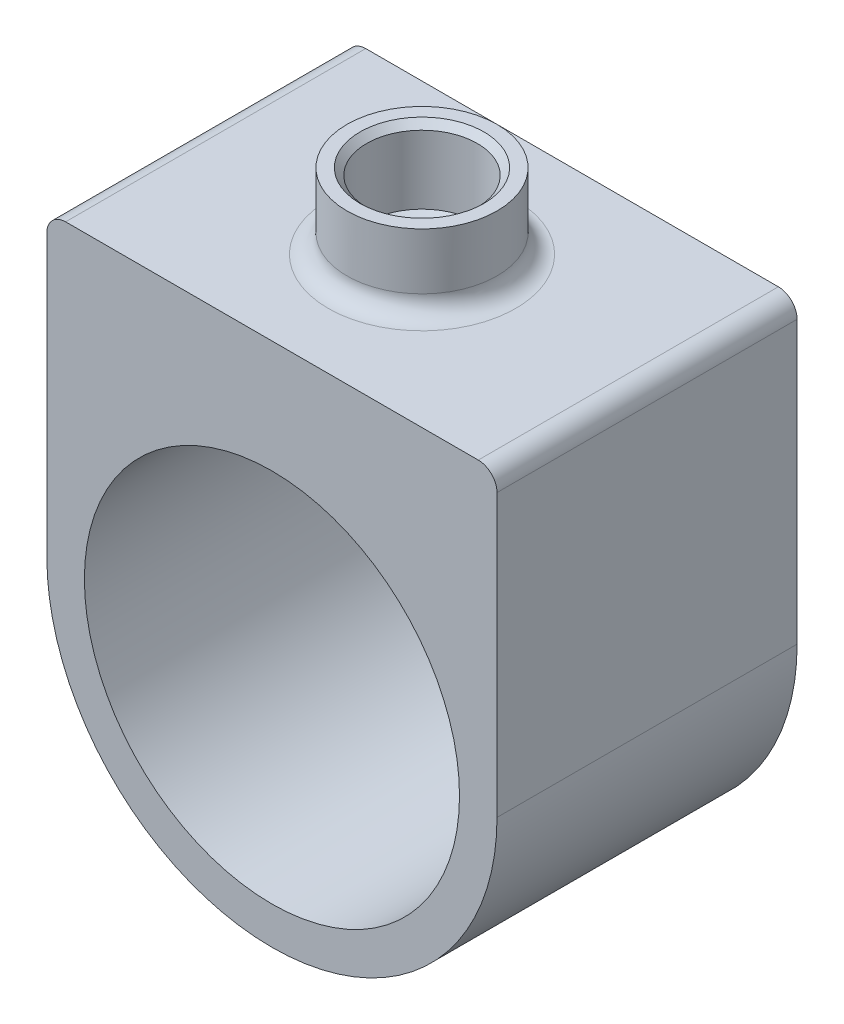
ISO-10303-21;
HEADER;
FILE_DESCRIPTION(('STEP AP214'),'2;1');
FILE_NAME('part.step','',(''),(''),'','','');
FILE_SCHEMA(('AUTOMOTIVE_DESIGN { 1 0 10303 214 1 1 1 1 }'));
ENDSEC;
DATA;
#1=APPLICATION_CONTEXT('core data for automotive mechanical design processes');
#2=APPLICATION_PROTOCOL_DEFINITION('international standard','automotive_design',2000,#1);
#3=PRODUCT_CONTEXT('',#1,'mechanical');
#4=PRODUCT('Part','Part','',(#3));
#5=PRODUCT_RELATED_PRODUCT_CATEGORY('part','',(#4));
#6=PRODUCT_DEFINITION_FORMATION('','',#4);
#7=PRODUCT_DEFINITION_CONTEXT('part definition',#1,'design');
#8=PRODUCT_DEFINITION('design','',#6,#7);
#9=PRODUCT_DEFINITION_SHAPE('','',#8);
#10=(LENGTH_UNIT() NAMED_UNIT(*) SI_UNIT(.MILLI.,.METRE.));
#11=(NAMED_UNIT(*) PLANE_ANGLE_UNIT() SI_UNIT($,.RADIAN.));
#12=(NAMED_UNIT(*) SI_UNIT($,.STERADIAN.) SOLID_ANGLE_UNIT());
#13=UNCERTAINTY_MEASURE_WITH_UNIT(LENGTH_MEASURE(1.E-05),#10,'distance_accuracy_value','');
#14=(GEOMETRIC_REPRESENTATION_CONTEXT(3) GLOBAL_UNCERTAINTY_ASSIGNED_CONTEXT((#13)) GLOBAL_UNIT_ASSIGNED_CONTEXT((#10,
#11,#12)) REPRESENTATION_CONTEXT('',''));
#15=CARTESIAN_POINT('',(0.,0.,0.));
#16=DIRECTION('',(0.,0.,1.));
#17=DIRECTION('',(1.,0.,0.));
#18=AXIS2_PLACEMENT_3D('',#15,#16,#17);
#19=CARTESIAN_POINT('',(0.,0.,40.));
#20=DIRECTION('',(0.,0.,1.));
#21=DIRECTION('',(1.,0.,0.));
#22=AXIS2_PLACEMENT_3D('',#19,#20,#21);
#23=PLANE('',#22);
#24=DIRECTION('',(0.,1.,0.));
#25=VECTOR('',#24,1.);
#26=CARTESIAN_POINT('',(60.,80.,40.));
#27=LINE('',#26,#25);
#28=CARTESIAN_POINT('',(60.,0.,40.));
#29=VERTEX_POINT('',#28);
#30=CARTESIAN_POINT('',(60.,75.,40.));
#31=VERTEX_POINT('',#30);
#32=EDGE_CURVE('E123',#29,#31,#27,.T.);
#33=ORIENTED_EDGE('',*,*,#32,.T.);
#34=CARTESIAN_POINT('',(55.,75.,40.));
#35=DIRECTION('',(0.,0.,1.));
#36=DIRECTION('',(1.,0.,0.));
#37=AXIS2_PLACEMENT_3D('',#34,#35,#36);
#38=CIRCLE('',#37,5.);
#39=CARTESIAN_POINT('',(55.,80.,40.));
#40=VERTEX_POINT('',#39);
#41=EDGE_CURVE('E155',#31,#40,#38,.T.);
#42=ORIENTED_EDGE('',*,*,#41,.T.);
#43=DIRECTION('',(-1.,0.,0.));
#44=VECTOR('',#43,1.);
#45=CARTESIAN_POINT('',(-60.,80.,40.));
#46=LINE('',#45,#44);
#47=CARTESIAN_POINT('',(-55.,80.,40.));
#48=VERTEX_POINT('',#47);
#49=EDGE_CURVE('E126',#40,#48,#46,.T.);
#50=ORIENTED_EDGE('',*,*,#49,.T.);
#51=CARTESIAN_POINT('',(-55.,75.,40.));
#52=DIRECTION('',(0.,0.,1.));
#53=DIRECTION('',(1.,0.,0.));
#54=AXIS2_PLACEMENT_3D('',#51,#52,#53);
#55=CIRCLE('',#54,5.);
#56=CARTESIAN_POINT('',(-60.,75.,40.));
#57=VERTEX_POINT('',#56);
#58=EDGE_CURVE('E52',#48,#57,#55,.T.);
#59=ORIENTED_EDGE('',*,*,#58,.T.);
#60=DIRECTION('',(0.,-1.,0.));
#61=VECTOR('',#60,1.);
#62=CARTESIAN_POINT('',(-60.,0.,40.));
#63=LINE('',#62,#61);
#64=CARTESIAN_POINT('',(-60.,0.,40.));
#65=VERTEX_POINT('',#64);
#66=EDGE_CURVE('E128',#57,#65,#63,.T.);
#67=ORIENTED_EDGE('',*,*,#66,.T.);
#68=CARTESIAN_POINT('',(0.,0.,40.));
#69=DIRECTION('',(0.,0.,1.));
#70=DIRECTION('',(1.,0.,0.));
#71=AXIS2_PLACEMENT_3D('',#68,#69,#70);
#72=CIRCLE('',#71,60.);
#73=EDGE_CURVE('E120',#65,#29,#72,.T.);
#74=ORIENTED_EDGE('',*,*,#73,.T.);
#75=EDGE_LOOP('',(#33,#42,#50,#59,#67,#74));
#76=FACE_BOUND('',#75,.T.);
#77=CARTESIAN_POINT('',(0.,0.,40.));
#78=DIRECTION('',(0.,0.,1.));
#79=DIRECTION('',(1.,0.,0.));
#80=AXIS2_PLACEMENT_3D('',#77,#78,#79);
#81=CIRCLE('',#80,50.);
#82=CARTESIAN_POINT('',(50.,0.,40.));
#83=VERTEX_POINT('',#82);
#84=EDGE_CURVE('E114',#83,#83,#81,.T.);
#85=ORIENTED_EDGE('',*,*,#84,.F.);
#86=EDGE_LOOP('',(#85));
#87=FACE_BOUND('',#86,.T.);
#88=ADVANCED_FACE('F37',(#76,#87),#23,.T.);
#89=CARTESIAN_POINT('',(0.,0.,-40.));
#90=DIRECTION('',(0.,0.,1.));
#91=DIRECTION('',(1.,0.,0.));
#92=AXIS2_PLACEMENT_3D('',#89,#90,#91);
#93=PLANE('',#92);
#94=DIRECTION('',(-1.,0.,0.));
#95=VECTOR('',#94,1.);
#96=CARTESIAN_POINT('',(-60.,80.,-40.));
#97=LINE('',#96,#95);
#98=CARTESIAN_POINT('',(55.,80.,-40.));
#99=VERTEX_POINT('',#98);
#100=CARTESIAN_POINT('',(-55.,80.,-40.));
#101=VERTEX_POINT('',#100);
#102=EDGE_CURVE('E135',#99,#101,#97,.T.);
#103=ORIENTED_EDGE('',*,*,#102,.F.);
#104=CARTESIAN_POINT('',(55.,75.,-40.));
#105=DIRECTION('',(0.,0.,1.));
#106=DIRECTION('',(1.,0.,0.));
#107=AXIS2_PLACEMENT_3D('',#104,#105,#106);
#108=CIRCLE('',#107,5.);
#109=CARTESIAN_POINT('',(60.,75.,-40.));
#110=VERTEX_POINT('',#109);
#111=EDGE_CURVE('E151',#99,#110,#108,.F.);
#112=ORIENTED_EDGE('',*,*,#111,.T.);
#113=DIRECTION('',(0.,1.,0.));
#114=VECTOR('',#113,1.);
#115=CARTESIAN_POINT('',(60.,80.,-40.));
#116=LINE('',#115,#114);
#117=CARTESIAN_POINT('',(60.,0.,-40.));
#118=VERTEX_POINT('',#117);
#119=EDGE_CURVE('E133',#118,#110,#116,.T.);
#120=ORIENTED_EDGE('',*,*,#119,.F.);
#121=CARTESIAN_POINT('',(0.,0.,-40.));
#122=DIRECTION('',(0.,0.,1.));
#123=DIRECTION('',(1.,0.,0.));
#124=AXIS2_PLACEMENT_3D('',#121,#122,#123);
#125=CIRCLE('',#124,60.);
#126=CARTESIAN_POINT('',(-60.,0.,-40.));
#127=VERTEX_POINT('',#126);
#128=EDGE_CURVE('E117',#127,#118,#125,.T.);
#129=ORIENTED_EDGE('',*,*,#128,.F.);
#130=DIRECTION('',(0.,-1.,0.));
#131=VECTOR('',#130,1.);
#132=CARTESIAN_POINT('',(-60.,0.,-40.));
#133=LINE('',#132,#131);
#134=CARTESIAN_POINT('',(-60.,75.,-40.));
#135=VERTEX_POINT('',#134);
#136=EDGE_CURVE('E124',#135,#127,#133,.T.);
#137=ORIENTED_EDGE('',*,*,#136,.F.);
#138=CARTESIAN_POINT('',(-55.,75.,-40.));
#139=DIRECTION('',(0.,0.,1.));
#140=DIRECTION('',(1.,0.,0.));
#141=AXIS2_PLACEMENT_3D('',#138,#139,#140);
#142=CIRCLE('',#141,5.);
#143=EDGE_CURVE('E149',#135,#101,#142,.F.);
#144=ORIENTED_EDGE('',*,*,#143,.T.);
#145=EDGE_LOOP('',(#103,#112,#120,#129,#137,#144));
#146=FACE_BOUND('',#145,.T.);
#147=CARTESIAN_POINT('',(0.,0.,-40.));
#148=DIRECTION('',(0.,0.,1.));
#149=DIRECTION('',(1.,0.,0.));
#150=AXIS2_PLACEMENT_3D('',#147,#148,#149);
#151=CIRCLE('',#150,50.);
#152=CARTESIAN_POINT('',(50.,0.,-40.));
#153=VERTEX_POINT('',#152);
#154=EDGE_CURVE('E107',#153,#153,#151,.T.);
#155=ORIENTED_EDGE('',*,*,#154,.T.);
#156=EDGE_LOOP('',(#155));
#157=FACE_BOUND('',#156,.T.);
#158=ADVANCED_FACE('F175',(#146,#157),#93,.F.);
#159=CARTESIAN_POINT('',(0.,0.,40.));
#160=DIRECTION('',(0.,0.,-1.));
#161=DIRECTION('',(-1.,0.,0.));
#162=AXIS2_PLACEMENT_3D('',#159,#160,#161);
#163=CYLINDRICAL_SURFACE('',#162,60.);
#164=ORIENTED_EDGE('',*,*,#128,.T.);
#165=DIRECTION('',(0.,0.,-1.));
#166=VECTOR('',#165,1.);
#167=CARTESIAN_POINT('',(60.,0.,40.));
#168=LINE('',#167,#166);
#169=EDGE_CURVE('E141',#29,#118,#168,.T.);
#170=ORIENTED_EDGE('',*,*,#169,.F.);
#171=ORIENTED_EDGE('',*,*,#73,.F.);
#172=DIRECTION('',(0.,0.,-1.));
#173=VECTOR('',#172,1.);
#174=CARTESIAN_POINT('',(-60.,0.,40.));
#175=LINE('',#174,#173);
#176=EDGE_CURVE('E130',#65,#127,#175,.T.);
#177=ORIENTED_EDGE('',*,*,#176,.T.);
#178=EDGE_LOOP('',(#164,#170,#171,#177));
#179=FACE_BOUND('',#178,.T.);
#180=ADVANCED_FACE('F180',(#179),#163,.T.);
#181=CARTESIAN_POINT('',(60.,80.,40.));
#182=DIRECTION('',(-1.,0.,0.));
#183=DIRECTION('',(0.,-1.,0.));
#184=AXIS2_PLACEMENT_3D('',#181,#182,#183);
#185=PLANE('',#184);
#186=ORIENTED_EDGE('',*,*,#119,.T.);
#187=DIRECTION('',(0.,0.,-1.));
#188=VECTOR('',#187,1.);
#189=CARTESIAN_POINT('',(60.,75.,40.));
#190=LINE('',#189,#188);
#191=EDGE_CURVE('E60',#110,#31,#190,.F.);
#192=ORIENTED_EDGE('',*,*,#191,.T.);
#193=ORIENTED_EDGE('',*,*,#32,.F.);
#194=ORIENTED_EDGE('',*,*,#169,.T.);
#195=EDGE_LOOP('',(#186,#192,#193,#194));
#196=FACE_BOUND('',#195,.T.);
#197=ADVANCED_FACE('F195',(#196),#185,.F.);
#198=CARTESIAN_POINT('',(-60.,80.,40.));
#199=DIRECTION('',(0.,-1.,0.));
#200=DIRECTION('',(0.,0.,-1.));
#201=AXIS2_PLACEMENT_3D('',#198,#199,#200);
#202=PLANE('',#201);
#203=CARTESIAN_POINT('',(0.,80.,0.));
#204=DIRECTION('',(0.,-1.,0.));
#205=DIRECTION('',(0.,0.,-1.));
#206=AXIS2_PLACEMENT_3D('',#203,#204,#205);
#207=CIRCLE('',#206,25.);
#208=CARTESIAN_POINT('',(0.,80.,-25.));
#209=VERTEX_POINT('',#208);
#210=EDGE_CURVE('E11',#209,#209,#207,.T.);
#211=ORIENTED_EDGE('',*,*,#210,.T.);
#212=EDGE_LOOP('',(#211));
#213=FACE_BOUND('',#212,.T.);
#214=ORIENTED_EDGE('',*,*,#49,.F.);
#215=DIRECTION('',(0.,0.,-1.));
#216=VECTOR('',#215,1.);
#217=CARTESIAN_POINT('',(55.,80.,40.));
#218=LINE('',#217,#216);
#219=EDGE_CURVE('E146',#40,#99,#218,.T.);
#220=ORIENTED_EDGE('',*,*,#219,.T.);
#221=ORIENTED_EDGE('',*,*,#102,.T.);
#222=DIRECTION('',(0.,0.,-1.));
#223=VECTOR('',#222,1.);
#224=CARTESIAN_POINT('',(-55.,80.,40.));
#225=LINE('',#224,#223);
#226=EDGE_CURVE('E144',#101,#48,#225,.F.);
#227=ORIENTED_EDGE('',*,*,#226,.T.);
#228=EDGE_LOOP('',(#214,#220,#221,#227));
#229=FACE_BOUND('',#228,.T.);
#230=ADVANCED_FACE('F191',(#213,#229),#202,.F.);
#231=CARTESIAN_POINT('',(-60.,0.,40.));
#232=DIRECTION('',(1.,0.,0.));
#233=DIRECTION('',(0.,0.,-1.));
#234=AXIS2_PLACEMENT_3D('',#231,#232,#233);
#235=PLANE('',#234);
#236=ORIENTED_EDGE('',*,*,#66,.F.);
#237=DIRECTION('',(0.,0.,-1.));
#238=VECTOR('',#237,1.);
#239=CARTESIAN_POINT('',(-60.,75.,40.));
#240=LINE('',#239,#238);
#241=EDGE_CURVE('E157',#57,#135,#240,.T.);
#242=ORIENTED_EDGE('',*,*,#241,.T.);
#243=ORIENTED_EDGE('',*,*,#136,.T.);
#244=ORIENTED_EDGE('',*,*,#176,.F.);
#245=EDGE_LOOP('',(#236,#242,#243,#244));
#246=FACE_BOUND('',#245,.T.);
#247=ADVANCED_FACE('F188',(#246),#235,.F.);
#248=CARTESIAN_POINT('',(0.,0.,40.));
#249=DIRECTION('',(0.,0.,-1.));
#250=DIRECTION('',(-1.,0.,0.));
#251=AXIS2_PLACEMENT_3D('',#248,#249,#250);
#252=CYLINDRICAL_SURFACE('',#251,50.);
#253=ORIENTED_EDGE('',*,*,#84,.T.);
#254=EDGE_LOOP('',(#253));
#255=FACE_BOUND('',#254,.T.);
#256=ORIENTED_EDGE('',*,*,#154,.F.);
#257=EDGE_LOOP('',(#256));
#258=FACE_BOUND('',#257,.T.);
#259=ADVANCED_FACE('F185',(#255,#258),#252,.F.);
#260=CARTESIAN_POINT('',(55.,75.,40.));
#261=DIRECTION('',(0.,0.,-1.));
#262=DIRECTION('',(-1.,0.,0.));
#263=AXIS2_PLACEMENT_3D('',#260,#261,#262);
#264=CYLINDRICAL_SURFACE('',#263,5.);
#265=ORIENTED_EDGE('',*,*,#41,.F.);
#266=ORIENTED_EDGE('',*,*,#191,.F.);
#267=ORIENTED_EDGE('',*,*,#111,.F.);
#268=ORIENTED_EDGE('',*,*,#219,.F.);
#269=EDGE_LOOP('',(#265,#266,#267,#268));
#270=FACE_BOUND('',#269,.T.);
#271=ADVANCED_FACE('F202',(#270),#264,.T.);
#272=CARTESIAN_POINT('',(-55.,75.,40.));
#273=DIRECTION('',(0.,0.,-1.));
#274=DIRECTION('',(-1.,0.,0.));
#275=AXIS2_PLACEMENT_3D('',#272,#273,#274);
#276=CYLINDRICAL_SURFACE('',#275,5.);
#277=ORIENTED_EDGE('',*,*,#58,.F.);
#278=ORIENTED_EDGE('',*,*,#226,.F.);
#279=ORIENTED_EDGE('',*,*,#143,.F.);
#280=ORIENTED_EDGE('',*,*,#241,.F.);
#281=EDGE_LOOP('',(#277,#278,#279,#280));
#282=FACE_BOUND('',#281,.T.);
#283=ADVANCED_FACE('F204',(#282),#276,.T.);
#284=CARTESIAN_POINT('',(0.,100.,0.));
#285=DIRECTION('',(0.,-1.,0.));
#286=DIRECTION('',(0.,0.,-1.));
#287=AXIS2_PLACEMENT_3D('',#284,#285,#286);
#288=CYLINDRICAL_SURFACE('',#287,20.);
#289=CARTESIAN_POINT('',(0.,85.,0.));
#290=DIRECTION('',(0.,-1.,0.));
#291=DIRECTION('',(0.,0.,-1.));
#292=AXIS2_PLACEMENT_3D('',#289,#290,#291);
#293=CIRCLE('',#292,20.);
#294=CARTESIAN_POINT('',(0.,85.,-20.));
#295=VERTEX_POINT('',#294);
#296=EDGE_CURVE('E45',#295,#295,#293,.F.);
#297=ORIENTED_EDGE('',*,*,#296,.T.);
#298=EDGE_LOOP('',(#297));
#299=FACE_BOUND('',#298,.T.);
#300=CARTESIAN_POINT('',(0.,100.,0.));
#301=DIRECTION('',(0.,1.,0.));
#302=DIRECTION('',(0.,0.,1.));
#303=AXIS2_PLACEMENT_3D('',#300,#301,#302);
#304=CIRCLE('',#303,20.);
#305=CARTESIAN_POINT('',(0.,100.,20.));
#306=VERTEX_POINT('',#305);
#307=EDGE_CURVE('E103',#306,#306,#304,.T.);
#308=ORIENTED_EDGE('',*,*,#307,.F.);
#309=EDGE_LOOP('',(#308));
#310=FACE_BOUND('',#309,.T.);
#311=ADVANCED_FACE('F162',(#299,#310),#288,.T.);
#312=CARTESIAN_POINT('',(0.,100.,0.));
#313=DIRECTION('',(0.,1.,0.));
#314=DIRECTION('',(0.,0.,1.));
#315=AXIS2_PLACEMENT_3D('',#312,#313,#314);
#316=PLANE('',#315);
#317=CARTESIAN_POINT('',(0.,100.,0.));
#318=DIRECTION('',(0.,1.,0.));
#319=DIRECTION('',(0.,0.,1.));
#320=AXIS2_PLACEMENT_3D('',#317,#318,#319);
#321=CIRCLE('',#320,16.525);
#322=CARTESIAN_POINT('',(0.,100.,16.525));
#323=VERTEX_POINT('',#322);
#324=EDGE_CURVE('E110',#323,#323,#321,.T.);
#325=ORIENTED_EDGE('',*,*,#324,.F.);
#326=EDGE_LOOP('',(#325));
#327=FACE_BOUND('',#326,.T.);
#328=ORIENTED_EDGE('',*,*,#307,.T.);
#329=EDGE_LOOP('',(#328));
#330=FACE_BOUND('',#329,.T.);
#331=ADVANCED_FACE('F97',(#327,#330),#316,.T.);
#332=CARTESIAN_POINT('',(0.,80.,0.));
#333=DIRECTION('',(0.,1.,0.));
#334=DIRECTION('',(0.,0.,1.));
#335=AXIS2_PLACEMENT_3D('',#332,#333,#334);
#336=CONICAL_SURFACE('',#335,14.75,1.02974425867665);
#337=CARTESIAN_POINT('',(0.,71.1373058693435,0.));
#338=VERTEX_POINT('',#337);
#339=VERTEX_LOOP('',#338);
#340=FACE_BOUND('',#339,.T.);
#341=CARTESIAN_POINT('',(0.,80.,0.));
#342=DIRECTION('',(0.,1.,0.));
#343=DIRECTION('',(0.,0.,1.));
#344=AXIS2_PLACEMENT_3D('',#341,#342,#343);
#345=CIRCLE('',#344,14.75);
#346=CARTESIAN_POINT('',(0.,80.,14.75));
#347=VERTEX_POINT('',#346);
#348=EDGE_CURVE('E101',#347,#347,#345,.T.);
#349=ORIENTED_EDGE('',*,*,#348,.T.);
#350=EDGE_LOOP('',(#349));
#351=FACE_BOUND('',#350,.T.);
#352=ADVANCED_FACE('F93',(#340,#351),#336,.F.);
#353=CARTESIAN_POINT('',(0.,100.,0.));
#354=DIRECTION('',(0.,1.,0.));
#355=DIRECTION('',(0.,0.,1.));
#356=AXIS2_PLACEMENT_3D('',#353,#354,#355);
#357=CYLINDRICAL_SURFACE('',#356,14.75);
#358=ORIENTED_EDGE('',*,*,#348,.F.);
#359=EDGE_LOOP('',(#358));
#360=FACE_BOUND('',#359,.T.);
#361=CARTESIAN_POINT('',(0.,98.225,0.));
#362=DIRECTION('',(0.,1.,0.));
#363=DIRECTION('',(0.,0.,1.));
#364=AXIS2_PLACEMENT_3D('',#361,#362,#363);
#365=CIRCLE('',#364,14.75);
#366=CARTESIAN_POINT('',(0.,98.225,14.75));
#367=VERTEX_POINT('',#366);
#368=EDGE_CURVE('E104',#367,#367,#365,.T.);
#369=ORIENTED_EDGE('',*,*,#368,.T.);
#370=EDGE_LOOP('',(#369));
#371=FACE_BOUND('',#370,.T.);
#372=ADVANCED_FACE('F96',(#360,#371),#357,.F.);
#373=CARTESIAN_POINT('',(0.,100.,0.));
#374=DIRECTION('',(0.,1.,0.));
#375=DIRECTION('',(0.,0.,1.));
#376=AXIS2_PLACEMENT_3D('',#373,#374,#375);
#377=CONICAL_SURFACE('',#376,16.525,0.78539816339745);
#378=ORIENTED_EDGE('',*,*,#368,.F.);
#379=EDGE_LOOP('',(#378));
#380=FACE_BOUND('',#379,.T.);
#381=ORIENTED_EDGE('',*,*,#324,.T.);
#382=EDGE_LOOP('',(#381));
#383=FACE_BOUND('',#382,.T.);
#384=ADVANCED_FACE('F166',(#380,#383),#377,.F.);
#385=CARTESIAN_POINT('',(0.,85.,0.));
#386=DIRECTION('',(0.,-1.,0.));
#387=DIRECTION('',(0.,0.,-1.));
#388=AXIS2_PLACEMENT_3D('',#385,#386,#387);
#389=TOROIDAL_SURFACE('',#388,25.,5.);
#390=ORIENTED_EDGE('',*,*,#210,.F.);
#391=EDGE_LOOP('',(#390));
#392=FACE_BOUND('',#391,.T.);
#393=ORIENTED_EDGE('',*,*,#296,.F.);
#394=EDGE_LOOP('',(#393));
#395=FACE_BOUND('',#394,.T.);
#396=ADVANCED_FACE('F39',(#392,#395),#389,.F.);
#397=CLOSED_SHELL('',(#88,#158,#180,#197,#230,#247,#259,#271,#283,#311,#331,#352,#372,#384,#396));
#398=MANIFOLD_SOLID_BREP('B2',#397);
#399=ADVANCED_BREP_SHAPE_REPRESENTATION('',(#18,#398),#14);
#400=SHAPE_DEFINITION_REPRESENTATION(#9,#399);
ENDSEC;
END-ISO-10303-21;
